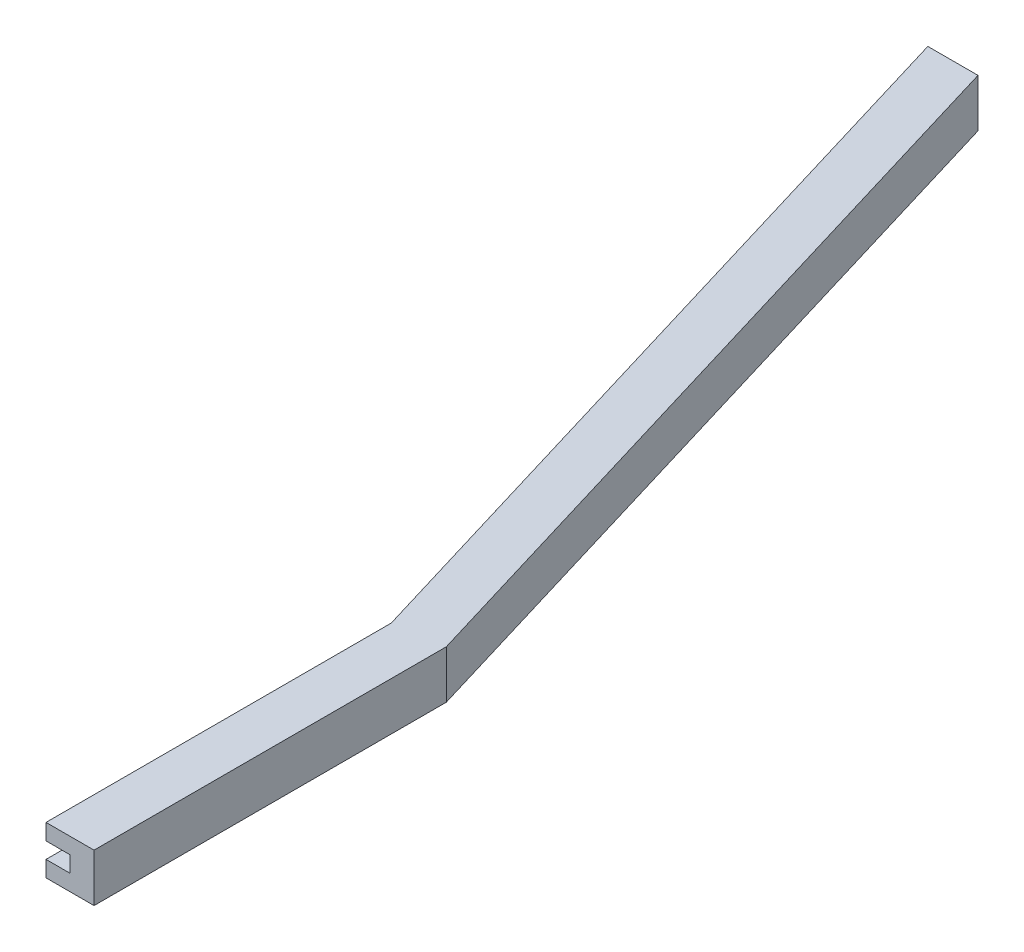
ISO-10303-21;
HEADER;
FILE_DESCRIPTION(('STEP AP214'),'2;1');
FILE_NAME('part.step','',(''),(''),'','','');
FILE_SCHEMA(('AUTOMOTIVE_DESIGN { 1 0 10303 214 1 1 1 1 }'));
ENDSEC;
DATA;
#1=APPLICATION_CONTEXT('core data for automotive mechanical design processes');
#2=APPLICATION_PROTOCOL_DEFINITION('international standard','automotive_design',2000,#1);
#3=PRODUCT_CONTEXT('',#1,'mechanical');
#4=PRODUCT('Part','Part','',(#3));
#5=PRODUCT_RELATED_PRODUCT_CATEGORY('part','',(#4));
#6=PRODUCT_DEFINITION_FORMATION('','',#4);
#7=PRODUCT_DEFINITION_CONTEXT('part definition',#1,'design');
#8=PRODUCT_DEFINITION('design','',#6,#7);
#9=PRODUCT_DEFINITION_SHAPE('','',#8);
#10=(LENGTH_UNIT() NAMED_UNIT(*) SI_UNIT(.MILLI.,.METRE.));
#11=(NAMED_UNIT(*) PLANE_ANGLE_UNIT() SI_UNIT($,.RADIAN.));
#12=(NAMED_UNIT(*) SI_UNIT($,.STERADIAN.) SOLID_ANGLE_UNIT());
#13=UNCERTAINTY_MEASURE_WITH_UNIT(LENGTH_MEASURE(1.E-05),#10,'distance_accuracy_value','');
#14=(GEOMETRIC_REPRESENTATION_CONTEXT(3) GLOBAL_UNCERTAINTY_ASSIGNED_CONTEXT((#13)) GLOBAL_UNIT_ASSIGNED_CONTEXT((#10,
#11,#12)) REPRESENTATION_CONTEXT('',''));
#15=CARTESIAN_POINT('',(0.,0.,0.));
#16=DIRECTION('',(0.,0.,1.));
#17=DIRECTION('',(1.,0.,0.));
#18=AXIS2_PLACEMENT_3D('',#15,#16,#17);
#19=CARTESIAN_POINT('',(0.,3.,0.));
#20=DIRECTION('',(0.,1.,0.));
#21=DIRECTION('',(0.,0.,1.));
#22=AXIS2_PLACEMENT_3D('',#19,#20,#21);
#23=PLANE('',#22);
#24=DIRECTION('',(0.288272472485393,0.,0.957548422591338));
#25=VECTOR('',#24,1.);
#26=CARTESIAN_POINT('',(19.5913797816014,3.,-5.89803643951368));
#27=LINE('',#26,#25);
#28=CARTESIAN_POINT('',(21.3669991728655,3.,0.));
#29=VERTEX_POINT('',#28);
#30=CARTESIAN_POINT('',(35.8,3.,47.9417859642579));
#31=VERTEX_POINT('',#30);
#32=EDGE_CURVE('E155',#29,#31,#27,.T.);
#33=ORIENTED_EDGE('',*,*,#32,.T.);
#34=DIRECTION('',(0.,0.,1.));
#35=VECTOR('',#34,1.);
#36=CARTESIAN_POINT('',(35.8,3.,0.));
#37=LINE('',#36,#35);
#38=CARTESIAN_POINT('',(35.8,3.,69.5));
#39=VERTEX_POINT('',#38);
#40=EDGE_CURVE('E158',#31,#39,#37,.T.);
#41=ORIENTED_EDGE('',*,*,#40,.T.);
#42=DIRECTION('',(-1.,0.,0.));
#43=VECTOR('',#42,1.);
#44=CARTESIAN_POINT('',(38.8,3.,69.5));
#45=LINE('',#44,#43);
#46=CARTESIAN_POINT('',(38.8,3.,69.5));
#47=VERTEX_POINT('',#46);
#48=EDGE_CURVE('E106',#47,#39,#45,.T.);
#49=ORIENTED_EDGE('',*,*,#48,.F.);
#50=DIRECTION('',(0.,0.,-1.));
#51=VECTOR('',#50,1.);
#52=CARTESIAN_POINT('',(38.8,3.,73.));
#53=LINE('',#52,#51);
#54=CARTESIAN_POINT('',(38.8,3.,47.5));
#55=VERTEX_POINT('',#54);
#56=EDGE_CURVE('E165',#47,#55,#53,.T.);
#57=ORIENTED_EDGE('',*,*,#56,.T.);
#58=DIRECTION('',(-0.288272472485392,0.,-0.957548422591338));
#59=VECTOR('',#58,1.);
#60=CARTESIAN_POINT('',(38.8,3.,47.5));
#61=LINE('',#60,#59);
#62=CARTESIAN_POINT('',(24.5,3.,0.));
#63=VERTEX_POINT('',#62);
#64=EDGE_CURVE('E68',#55,#63,#61,.T.);
#65=ORIENTED_EDGE('',*,*,#64,.T.);
#66=DIRECTION('',(-1.,0.,0.));
#67=VECTOR('',#66,1.);
#68=CARTESIAN_POINT('',(24.5,3.,0.));
#69=LINE('',#68,#67);
#70=EDGE_CURVE('E91',#63,#29,#69,.T.);
#71=ORIENTED_EDGE('',*,*,#70,.T.);
#72=EDGE_LOOP('',(#33,#41,#49,#57,#65,#71));
#73=FACE_BOUND('',#72,.T.);
#74=ADVANCED_FACE('F46',(#73),#23,.T.);
#75=CARTESIAN_POINT('',(0.,0.,0.));
#76=DIRECTION('',(0.,1.,0.));
#77=DIRECTION('',(0.,0.,1.));
#78=AXIS2_PLACEMENT_3D('',#75,#76,#77);
#79=PLANE('',#78);
#80=DIRECTION('',(0.288272472485393,0.,0.957548422591338));
#81=VECTOR('',#80,1.);
#82=CARTESIAN_POINT('',(19.5913797816014,0.,-5.89803643951368));
#83=LINE('',#82,#81);
#84=CARTESIAN_POINT('',(21.3669991728655,0.,0.));
#85=VERTEX_POINT('',#84);
#86=CARTESIAN_POINT('',(35.8,0.,47.9417859642579));
#87=VERTEX_POINT('',#86);
#88=EDGE_CURVE('E104',#85,#87,#83,.T.);
#89=ORIENTED_EDGE('',*,*,#88,.F.);
#90=DIRECTION('',(-1.,0.,0.));
#91=VECTOR('',#90,1.);
#92=CARTESIAN_POINT('',(24.5,0.,0.));
#93=LINE('',#92,#91);
#94=CARTESIAN_POINT('',(24.5,0.,0.));
#95=VERTEX_POINT('',#94);
#96=EDGE_CURVE('E98',#95,#85,#93,.T.);
#97=ORIENTED_EDGE('',*,*,#96,.F.);
#98=DIRECTION('',(-0.288272472485392,0.,-0.957548422591338));
#99=VECTOR('',#98,1.);
#100=CARTESIAN_POINT('',(38.8,0.,47.5));
#101=LINE('',#100,#99);
#102=CARTESIAN_POINT('',(38.8,0.,47.5));
#103=VERTEX_POINT('',#102);
#104=EDGE_CURVE('E81',#103,#95,#101,.T.);
#105=ORIENTED_EDGE('',*,*,#104,.F.);
#106=DIRECTION('',(0.,0.,-1.));
#107=VECTOR('',#106,1.);
#108=CARTESIAN_POINT('',(38.8,0.,73.));
#109=LINE('',#108,#107);
#110=CARTESIAN_POINT('',(38.8,0.,69.5));
#111=VERTEX_POINT('',#110);
#112=EDGE_CURVE('E92',#111,#103,#109,.T.);
#113=ORIENTED_EDGE('',*,*,#112,.F.);
#114=DIRECTION('',(-1.,0.,0.));
#115=VECTOR('',#114,1.);
#116=CARTESIAN_POINT('',(38.8,0.,69.5));
#117=LINE('',#116,#115);
#118=CARTESIAN_POINT('',(35.8,0.,69.5));
#119=VERTEX_POINT('',#118);
#120=EDGE_CURVE('E110',#111,#119,#117,.T.);
#121=ORIENTED_EDGE('',*,*,#120,.T.);
#122=DIRECTION('',(0.,0.,1.));
#123=VECTOR('',#122,1.);
#124=CARTESIAN_POINT('',(35.8,0.,0.));
#125=LINE('',#124,#123);
#126=EDGE_CURVE('E159',#87,#119,#125,.T.);
#127=ORIENTED_EDGE('',*,*,#126,.F.);
#128=EDGE_LOOP('',(#89,#97,#105,#113,#121,#127));
#129=FACE_BOUND('',#128,.T.);
#130=ADVANCED_FACE('F101',(#129),#79,.F.);
#131=CARTESIAN_POINT('',(24.5,3.,0.));
#132=DIRECTION('',(0.,0.,1.));
#133=DIRECTION('',(1.,0.,0.));
#134=AXIS2_PLACEMENT_3D('',#131,#132,#133);
#135=PLANE('',#134);
#136=DIRECTION('',(0.,-1.,0.));
#137=VECTOR('',#136,1.);
#138=CARTESIAN_POINT('',(21.3669991728655,3.,0.));
#139=LINE('',#138,#137);
#140=EDGE_CURVE('E289',#29,#85,#139,.T.);
#141=ORIENTED_EDGE('',*,*,#140,.F.);
#142=ORIENTED_EDGE('',*,*,#70,.F.);
#143=DIRECTION('',(0.,-1.,0.));
#144=VECTOR('',#143,1.);
#145=CARTESIAN_POINT('',(24.5,3.,0.));
#146=LINE('',#145,#144);
#147=EDGE_CURVE('E84',#63,#95,#146,.T.);
#148=ORIENTED_EDGE('',*,*,#147,.T.);
#149=ORIENTED_EDGE('',*,*,#96,.T.);
#150=EDGE_LOOP('',(#141,#142,#148,#149));
#151=FACE_BOUND('',#150,.T.);
#152=ADVANCED_FACE('F48',(#151),#135,.F.);
#153=CARTESIAN_POINT('',(77.5329849057445,1.,0.));
#154=DIRECTION('',(0.,-1.,0.));
#155=DIRECTION('',(0.,0.,-1.));
#156=AXIS2_PLACEMENT_3D('',#153,#154,#155);
#157=PLANE('',#156);
#158=DIRECTION('',(1.,0.,0.));
#159=VECTOR('',#158,1.);
#160=CARTESIAN_POINT('',(-0.199999999999998,0.999999999999995,1.5));
#161=LINE('',#160,#159);
#162=CARTESIAN_POINT('',(21.8185781202339,0.999999999999997,1.5));
#163=VERTEX_POINT('',#162);
#164=CARTESIAN_POINT('',(23.8366574811696,0.999999999999997,1.5));
#165=VERTEX_POINT('',#164);
#166=EDGE_CURVE('E130',#163,#165,#161,.T.);
#167=ORIENTED_EDGE('',*,*,#166,.F.);
#168=DIRECTION('',(0.288272472485393,0.,0.957548422591338));
#169=VECTOR('',#168,1.);
#170=CARTESIAN_POINT('',(19.5913797816014,1.,-5.89803643951368));
#171=LINE('',#170,#169);
#172=CARTESIAN_POINT('',(35.8,0.999999999999994,47.9417859642579));
#173=VERTEX_POINT('',#172);
#174=EDGE_CURVE('E54',#163,#173,#171,.T.);
#175=ORIENTED_EDGE('',*,*,#174,.T.);
#176=DIRECTION('',(0.,0.,1.));
#177=VECTOR('',#176,1.);
#178=CARTESIAN_POINT('',(35.8,1.,0.));
#179=LINE('',#178,#177);
#180=CARTESIAN_POINT('',(35.8,0.999999999999995,69.5));
#181=VERTEX_POINT('',#180);
#182=EDGE_CURVE('E126',#173,#181,#179,.T.);
#183=ORIENTED_EDGE('',*,*,#182,.T.);
#184=DIRECTION('',(-1.,0.,0.));
#185=VECTOR('',#184,1.);
#186=CARTESIAN_POINT('',(60.8227155455453,0.999999999999995,69.5));
#187=LINE('',#186,#185);
#188=CARTESIAN_POINT('',(37.3,0.999999999999995,69.5));
#189=VERTEX_POINT('',#188);
#190=EDGE_CURVE('E190',#189,#181,#187,.T.);
#191=ORIENTED_EDGE('',*,*,#190,.F.);
#192=DIRECTION('',(0.,0.,-1.));
#193=VECTOR('',#192,1.);
#194=CARTESIAN_POINT('',(37.3,1.,0.));
#195=LINE('',#194,#193);
#196=CARTESIAN_POINT('',(37.3,0.999999999999994,47.5));
#197=VERTEX_POINT('',#196);
#198=EDGE_CURVE('E143',#189,#197,#195,.T.);
#199=ORIENTED_EDGE('',*,*,#198,.T.);
#200=DIRECTION('',(-1.,0.,0.));
#201=VECTOR('',#200,1.);
#202=CARTESIAN_POINT('',(60.8227155455453,0.999999999999994,47.5));
#203=LINE('',#202,#201);
#204=CARTESIAN_POINT('',(37.2334995864328,0.999999999999994,47.5));
#205=VERTEX_POINT('',#204);
#206=EDGE_CURVE('E199',#197,#205,#203,.T.);
#207=ORIENTED_EDGE('',*,*,#206,.T.);
#208=DIRECTION('',(-0.288272472485393,0.,-0.957548422591338));
#209=VECTOR('',#208,1.);
#210=CARTESIAN_POINT('',(27.4707724201926,0.999999999999998,15.0713608114399));
#211=LINE('',#210,#209);
#212=CARTESIAN_POINT('',(23.8366574811696,0.999999999999997,3.));
#213=VERTEX_POINT('',#212);
#214=EDGE_CURVE('E216',#205,#213,#211,.T.);
#215=ORIENTED_EDGE('',*,*,#214,.T.);
#216=DIRECTION('',(0.,0.,1.));
#217=VECTOR('',#216,1.);
#218=CARTESIAN_POINT('',(23.8366574811696,0.999999999999997,1.5));
#219=LINE('',#218,#217);
#220=EDGE_CURVE('E250',#165,#213,#219,.T.);
#221=ORIENTED_EDGE('',*,*,#220,.F.);
#222=EDGE_LOOP('',(#167,#175,#183,#191,#199,#207,#215,#221));
#223=FACE_BOUND('',#222,.T.);
#224=ADVANCED_FACE('F123',(#223),#157,.F.);
#225=CARTESIAN_POINT('',(77.5329849057445,2.,0.));
#226=DIRECTION('',(0.,-1.,0.));
#227=DIRECTION('',(0.,0.,-1.));
#228=AXIS2_PLACEMENT_3D('',#225,#226,#227);
#229=PLANE('',#228);
#230=DIRECTION('',(0.,0.,1.));
#231=VECTOR('',#230,1.);
#232=CARTESIAN_POINT('',(35.8,2.,0.));
#233=LINE('',#232,#231);
#234=CARTESIAN_POINT('',(35.8,1.99999999999999,47.9417859642579));
#235=VERTEX_POINT('',#234);
#236=CARTESIAN_POINT('',(35.8,1.99999999999999,69.5));
#237=VERTEX_POINT('',#236);
#238=EDGE_CURVE('E142',#235,#237,#233,.T.);
#239=ORIENTED_EDGE('',*,*,#238,.F.);
#240=DIRECTION('',(0.288272472485393,0.,0.957548422591338));
#241=VECTOR('',#240,1.);
#242=CARTESIAN_POINT('',(19.5913797816014,2.,-5.89803643951368));
#243=LINE('',#242,#241);
#244=CARTESIAN_POINT('',(21.8185781202339,1.99999999999999,1.5));
#245=VERTEX_POINT('',#244);
#246=EDGE_CURVE('E116',#245,#235,#243,.T.);
#247=ORIENTED_EDGE('',*,*,#246,.F.);
#248=DIRECTION('',(-1.,0.,0.));
#249=VECTOR('',#248,1.);
#250=CARTESIAN_POINT('',(-0.199999999999998,1.99999999999999,1.5));
#251=LINE('',#250,#249);
#252=CARTESIAN_POINT('',(23.8366574811696,1.99999999999999,1.5));
#253=VERTEX_POINT('',#252);
#254=EDGE_CURVE('E295',#253,#245,#251,.T.);
#255=ORIENTED_EDGE('',*,*,#254,.F.);
#256=DIRECTION('',(0.,0.,1.));
#257=VECTOR('',#256,1.);
#258=CARTESIAN_POINT('',(23.8366574811696,1.99999999999999,1.5));
#259=LINE('',#258,#257);
#260=CARTESIAN_POINT('',(23.8366574811696,1.99999999999999,3.));
#261=VERTEX_POINT('',#260);
#262=EDGE_CURVE('E205',#253,#261,#259,.T.);
#263=ORIENTED_EDGE('',*,*,#262,.T.);
#264=DIRECTION('',(-0.288272472485393,0.,-0.957548422591338));
#265=VECTOR('',#264,1.);
#266=CARTESIAN_POINT('',(27.4707724201926,2.,15.0713608114399));
#267=LINE('',#266,#265);
#268=CARTESIAN_POINT('',(37.2334995864328,1.99999999999999,47.5));
#269=VERTEX_POINT('',#268);
#270=EDGE_CURVE('E152',#269,#261,#267,.T.);
#271=ORIENTED_EDGE('',*,*,#270,.F.);
#272=DIRECTION('',(-1.,0.,0.));
#273=VECTOR('',#272,1.);
#274=CARTESIAN_POINT('',(60.8227155455453,1.99999999999999,47.5));
#275=LINE('',#274,#273);
#276=CARTESIAN_POINT('',(37.3,1.99999999999999,47.5));
#277=VERTEX_POINT('',#276);
#278=EDGE_CURVE('E202',#277,#269,#275,.T.);
#279=ORIENTED_EDGE('',*,*,#278,.F.);
#280=DIRECTION('',(0.,0.,-1.));
#281=VECTOR('',#280,1.);
#282=CARTESIAN_POINT('',(37.3,2.,0.));
#283=LINE('',#282,#281);
#284=CARTESIAN_POINT('',(37.3,1.99999999999999,69.5));
#285=VERTEX_POINT('',#284);
#286=EDGE_CURVE('E240',#285,#277,#283,.T.);
#287=ORIENTED_EDGE('',*,*,#286,.F.);
#288=DIRECTION('',(-1.,0.,0.));
#289=VECTOR('',#288,1.);
#290=CARTESIAN_POINT('',(60.8227155455453,1.99999999999999,69.5));
#291=LINE('',#290,#289);
#292=EDGE_CURVE('E198',#285,#237,#291,.T.);
#293=ORIENTED_EDGE('',*,*,#292,.T.);
#294=EDGE_LOOP('',(#239,#247,#255,#263,#271,#279,#287,#293));
#295=FACE_BOUND('',#294,.T.);
#296=ADVANCED_FACE('F237',(#295),#229,.T.);
#297=CARTESIAN_POINT('',(0.,0.,1.5));
#298=DIRECTION('',(0.,0.,1.));
#299=DIRECTION('',(1.,0.,0.));
#300=AXIS2_PLACEMENT_3D('',#297,#298,#299);
#301=PLANE('',#300);
#302=ORIENTED_EDGE('',*,*,#254,.T.);
#303=DIRECTION('',(0.,-1.,0.));
#304=VECTOR('',#303,1.);
#305=CARTESIAN_POINT('',(21.8185781202339,0.,1.5));
#306=LINE('',#305,#304);
#307=EDGE_CURVE('E14',#245,#163,#306,.T.);
#308=ORIENTED_EDGE('',*,*,#307,.T.);
#309=ORIENTED_EDGE('',*,*,#166,.T.);
#310=DIRECTION('',(0.,1.,0.));
#311=VECTOR('',#310,1.);
#312=CARTESIAN_POINT('',(23.8366574811696,1.99999999999999,1.5));
#313=LINE('',#312,#311);
#314=EDGE_CURVE('E291',#165,#253,#313,.T.);
#315=ORIENTED_EDGE('',*,*,#314,.T.);
#316=EDGE_LOOP('',(#302,#308,#309,#315));
#317=FACE_BOUND('',#316,.T.);
#318=ADVANCED_FACE('F298',(#317),#301,.T.);
#319=CARTESIAN_POINT('',(35.8,0.,0.));
#320=DIRECTION('',(-1.,0.,0.));
#321=DIRECTION('',(0.,0.,1.));
#322=AXIS2_PLACEMENT_3D('',#319,#320,#321);
#323=PLANE('',#322);
#324=ORIENTED_EDGE('',*,*,#40,.F.);
#325=DIRECTION('',(0.,1.,0.));
#326=VECTOR('',#325,1.);
#327=CARTESIAN_POINT('',(35.8,0.,47.9417859642579));
#328=LINE('',#327,#326);
#329=EDGE_CURVE('E147',#235,#31,#328,.T.);
#330=ORIENTED_EDGE('',*,*,#329,.F.);
#331=ORIENTED_EDGE('',*,*,#238,.T.);
#332=DIRECTION('',(0.,1.,0.));
#333=VECTOR('',#332,1.);
#334=CARTESIAN_POINT('',(35.8,0.,69.5));
#335=LINE('',#334,#333);
#336=EDGE_CURVE('E146',#237,#39,#335,.T.);
#337=ORIENTED_EDGE('',*,*,#336,.T.);
#338=EDGE_LOOP('',(#324,#330,#331,#337));
#339=FACE_BOUND('',#338,.T.);
#340=ADVANCED_FACE('F230',(#339),#323,.T.);
#341=CARTESIAN_POINT('',(38.8,0.,69.5));
#342=DIRECTION('',(0.,0.,-1.));
#343=DIRECTION('',(-1.,0.,0.));
#344=AXIS2_PLACEMENT_3D('',#341,#342,#343);
#345=PLANE('',#344);
#346=ORIENTED_EDGE('',*,*,#292,.F.);
#347=DIRECTION('',(0.,1.,0.));
#348=VECTOR('',#347,1.);
#349=CARTESIAN_POINT('',(37.3,0.,69.5));
#350=LINE('',#349,#348);
#351=EDGE_CURVE('E193',#189,#285,#350,.T.);
#352=ORIENTED_EDGE('',*,*,#351,.F.);
#353=ORIENTED_EDGE('',*,*,#190,.T.);
#354=EDGE_CURVE('E141',#119,#181,#335,.T.);
#355=ORIENTED_EDGE('',*,*,#354,.F.);
#356=ORIENTED_EDGE('',*,*,#120,.F.);
#357=DIRECTION('',(0.,1.,0.));
#358=VECTOR('',#357,1.);
#359=CARTESIAN_POINT('',(38.8,0.,69.5));
#360=LINE('',#359,#358);
#361=EDGE_CURVE('E162',#111,#47,#360,.T.);
#362=ORIENTED_EDGE('',*,*,#361,.T.);
#363=ORIENTED_EDGE('',*,*,#48,.T.);
#364=ORIENTED_EDGE('',*,*,#336,.F.);
#365=EDGE_LOOP('',(#346,#352,#353,#355,#356,#362,#363,#364));
#366=FACE_BOUND('',#365,.T.);
#367=ADVANCED_FACE('F188',(#366),#345,.F.);
#368=CARTESIAN_POINT('',(38.8,3.,73.));
#369=DIRECTION('',(-1.,0.,0.));
#370=DIRECTION('',(0.,0.,1.));
#371=AXIS2_PLACEMENT_3D('',#368,#369,#370);
#372=PLANE('',#371);
#373=ORIENTED_EDGE('',*,*,#56,.F.);
#374=ORIENTED_EDGE('',*,*,#361,.F.);
#375=ORIENTED_EDGE('',*,*,#112,.T.);
#376=DIRECTION('',(0.,-1.,0.));
#377=VECTOR('',#376,1.);
#378=CARTESIAN_POINT('',(38.8,3.,47.5));
#379=LINE('',#378,#377);
#380=EDGE_CURVE('E87',#55,#103,#379,.T.);
#381=ORIENTED_EDGE('',*,*,#380,.F.);
#382=EDGE_LOOP('',(#373,#374,#375,#381));
#383=FACE_BOUND('',#382,.T.);
#384=ADVANCED_FACE('F170',(#383),#372,.F.);
#385=CARTESIAN_POINT('',(38.8,3.,47.5));
#386=DIRECTION('',(-0.957548422591337,0.,0.288272472485392));
#387=DIRECTION('',(0.288272472485392,0.,0.957548422591338));
#388=AXIS2_PLACEMENT_3D('',#385,#386,#387);
#389=PLANE('',#388);
#390=ORIENTED_EDGE('',*,*,#104,.T.);
#391=ORIENTED_EDGE('',*,*,#147,.F.);
#392=ORIENTED_EDGE('',*,*,#64,.F.);
#393=ORIENTED_EDGE('',*,*,#380,.T.);
#394=EDGE_LOOP('',(#390,#391,#392,#393));
#395=FACE_BOUND('',#394,.T.);
#396=ADVANCED_FACE('F83',(#395),#389,.F.);
#397=CARTESIAN_POINT('',(19.5913797816014,0.,-5.89803643951368));
#398=DIRECTION('',(-0.957548422591337,0.,0.288272472485392));
#399=DIRECTION('',(0.288272472485393,0.,0.957548422591338));
#400=AXIS2_PLACEMENT_3D('',#397,#398,#399);
#401=PLANE('',#400);
#402=EDGE_CURVE('E139',#87,#173,#328,.T.);
#403=ORIENTED_EDGE('',*,*,#402,.T.);
#404=ORIENTED_EDGE('',*,*,#174,.F.);
#405=ORIENTED_EDGE('',*,*,#307,.F.);
#406=ORIENTED_EDGE('',*,*,#246,.T.);
#407=ORIENTED_EDGE('',*,*,#329,.T.);
#408=ORIENTED_EDGE('',*,*,#32,.F.);
#409=ORIENTED_EDGE('',*,*,#140,.T.);
#410=ORIENTED_EDGE('',*,*,#88,.T.);
#411=EDGE_LOOP('',(#403,#404,#405,#406,#407,#408,#409,#410));
#412=FACE_BOUND('',#411,.T.);
#413=ADVANCED_FACE('F145',(#412),#401,.T.);
#414=ORIENTED_EDGE('',*,*,#182,.F.);
#415=ORIENTED_EDGE('',*,*,#402,.F.);
#416=ORIENTED_EDGE('',*,*,#126,.T.);
#417=ORIENTED_EDGE('',*,*,#354,.T.);
#418=EDGE_LOOP('',(#414,#415,#416,#417));
#419=FACE_BOUND('',#418,.T.);
#420=ADVANCED_FACE('F136',(#419),#323,.T.);
#421=CARTESIAN_POINT('',(21.0277024154884,0.,-6.33044514824177));
#422=DIRECTION('',(-0.957548422591337,0.,0.288272472485392));
#423=DIRECTION('',(0.288272472485393,0.,0.957548422591338));
#424=AXIS2_PLACEMENT_3D('',#421,#422,#423);
#425=PLANE('',#424);
#426=DIRECTION('',(0.,1.,0.));
#427=VECTOR('',#426,1.);
#428=CARTESIAN_POINT('',(37.2334995864327,0.,47.5));
#429=LINE('',#428,#427);
#430=EDGE_CURVE('E219',#205,#269,#429,.T.);
#431=ORIENTED_EDGE('',*,*,#430,.T.);
#432=ORIENTED_EDGE('',*,*,#270,.T.);
#433=DIRECTION('',(0.,-1.,0.));
#434=VECTOR('',#433,1.);
#435=CARTESIAN_POINT('',(23.8366574811696,0.,3.));
#436=LINE('',#435,#434);
#437=EDGE_CURVE('E215',#261,#213,#436,.T.);
#438=ORIENTED_EDGE('',*,*,#437,.T.);
#439=ORIENTED_EDGE('',*,*,#214,.F.);
#440=EDGE_LOOP('',(#431,#432,#438,#439));
#441=FACE_BOUND('',#440,.T.);
#442=ADVANCED_FACE('F267',(#441),#425,.T.);
#443=CARTESIAN_POINT('',(60.8227155455453,0.,47.5));
#444=DIRECTION('',(0.,0.,-1.));
#445=DIRECTION('',(-1.,0.,0.));
#446=AXIS2_PLACEMENT_3D('',#443,#444,#445);
#447=PLANE('',#446);
#448=ORIENTED_EDGE('',*,*,#430,.F.);
#449=ORIENTED_EDGE('',*,*,#206,.F.);
#450=DIRECTION('',(0.,1.,0.));
#451=VECTOR('',#450,1.);
#452=CARTESIAN_POINT('',(37.3,0.,47.5));
#453=LINE('',#452,#451);
#454=EDGE_CURVE('E211',#197,#277,#453,.T.);
#455=ORIENTED_EDGE('',*,*,#454,.T.);
#456=ORIENTED_EDGE('',*,*,#278,.T.);
#457=EDGE_LOOP('',(#448,#449,#455,#456));
#458=FACE_BOUND('',#457,.T.);
#459=ADVANCED_FACE('F256',(#458),#447,.F.);
#460=CARTESIAN_POINT('',(37.3,0.,0.));
#461=DIRECTION('',(-1.,0.,0.));
#462=DIRECTION('',(0.,0.,1.));
#463=AXIS2_PLACEMENT_3D('',#460,#461,#462);
#464=PLANE('',#463);
#465=ORIENTED_EDGE('',*,*,#454,.F.);
#466=ORIENTED_EDGE('',*,*,#198,.F.);
#467=ORIENTED_EDGE('',*,*,#351,.T.);
#468=ORIENTED_EDGE('',*,*,#286,.T.);
#469=EDGE_LOOP('',(#465,#466,#467,#468));
#470=FACE_BOUND('',#469,.T.);
#471=ADVANCED_FACE('F247',(#470),#464,.T.);
#472=CARTESIAN_POINT('',(23.8366574811696,1.99999999999999,1.5));
#473=DIRECTION('',(1.,0.,0.));
#474=DIRECTION('',(0.,0.,-1.));
#475=AXIS2_PLACEMENT_3D('',#472,#473,#474);
#476=PLANE('',#475);
#477=ORIENTED_EDGE('',*,*,#437,.F.);
#478=ORIENTED_EDGE('',*,*,#262,.F.);
#479=ORIENTED_EDGE('',*,*,#314,.F.);
#480=ORIENTED_EDGE('',*,*,#220,.T.);
#481=EDGE_LOOP('',(#477,#478,#479,#480));
#482=FACE_BOUND('',#481,.T.);
#483=ADVANCED_FACE('F275',(#482),#476,.F.);
#484=CLOSED_SHELL('',(#74,#130,#152,#224,#296,#318,#340,#367,#384,#396,#413,#420,#442,#459,#471,#483));
#485=MANIFOLD_SOLID_BREP('B2',#484);
#486=ADVANCED_BREP_SHAPE_REPRESENTATION('',(#18,#485),#14);
#487=SHAPE_DEFINITION_REPRESENTATION(#9,#486);
ENDSEC;
END-ISO-10303-21;
